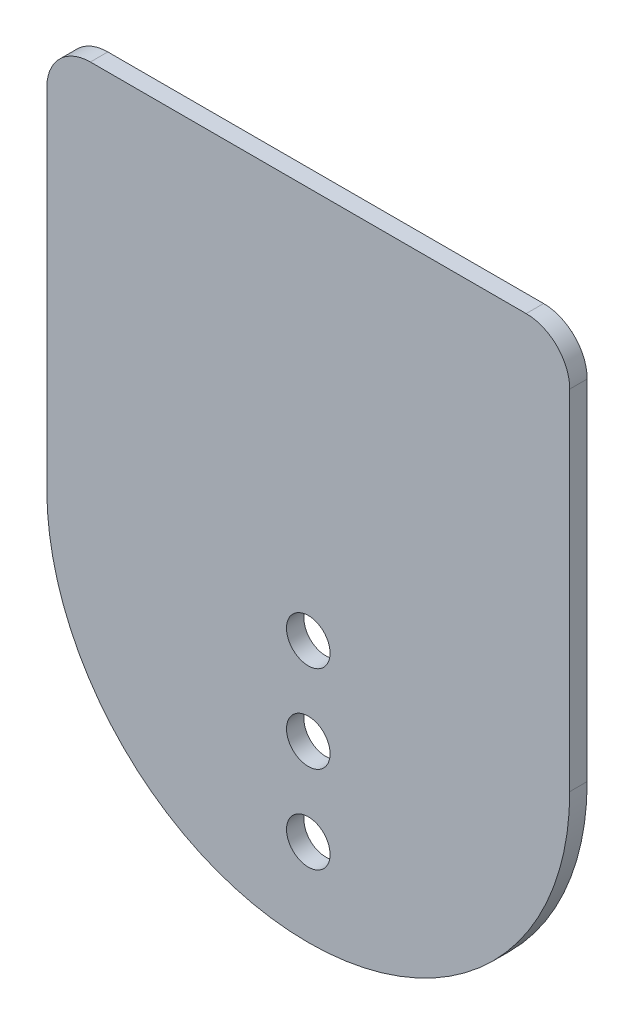
ISO-10303-21;
HEADER;
FILE_DESCRIPTION(('STEP AP214'),'2;1');
FILE_NAME('part.step','',(''),(''),'','','');
FILE_SCHEMA(('AUTOMOTIVE_DESIGN { 1 0 10303 214 1 1 1 1 }'));
ENDSEC;
DATA;
#1=APPLICATION_CONTEXT('core data for automotive mechanical design processes');
#2=APPLICATION_PROTOCOL_DEFINITION('international standard','automotive_design',2000,#1);
#3=PRODUCT_CONTEXT('',#1,'mechanical');
#4=PRODUCT('Part','Part','',(#3));
#5=PRODUCT_RELATED_PRODUCT_CATEGORY('part','',(#4));
#6=PRODUCT_DEFINITION_FORMATION('','',#4);
#7=PRODUCT_DEFINITION_CONTEXT('part definition',#1,'design');
#8=PRODUCT_DEFINITION('design','',#6,#7);
#9=PRODUCT_DEFINITION_SHAPE('','',#8);
#10=(LENGTH_UNIT() NAMED_UNIT(*) SI_UNIT(.MILLI.,.METRE.));
#11=(NAMED_UNIT(*) PLANE_ANGLE_UNIT() SI_UNIT($,.RADIAN.));
#12=(NAMED_UNIT(*) SI_UNIT($,.STERADIAN.) SOLID_ANGLE_UNIT());
#13=UNCERTAINTY_MEASURE_WITH_UNIT(LENGTH_MEASURE(1.E-05),#10,'distance_accuracy_value','');
#14=(GEOMETRIC_REPRESENTATION_CONTEXT(3) GLOBAL_UNCERTAINTY_ASSIGNED_CONTEXT((#13)) GLOBAL_UNIT_ASSIGNED_CONTEXT((#10,
#11,#12)) REPRESENTATION_CONTEXT('',''));
#15=CARTESIAN_POINT('',(0.,0.,0.));
#16=DIRECTION('',(0.,0.,1.));
#17=DIRECTION('',(1.,0.,0.));
#18=AXIS2_PLACEMENT_3D('',#15,#16,#17);
#19=CARTESIAN_POINT('',(10.,-10.,2.));
#20=DIRECTION('',(0.,0.,-1.));
#21=DIRECTION('',(-1.,0.,0.));
#22=AXIS2_PLACEMENT_3D('',#19,#20,#21);
#23=PLANE('',#22);
#24=CARTESIAN_POINT('',(10.,-10.,2.));
#25=DIRECTION('',(0.,0.,1.));
#26=DIRECTION('',(-1.,0.,0.));
#27=AXIS2_PLACEMENT_3D('',#24,#25,#26);
#28=CIRCLE('',#27,10.);
#29=CARTESIAN_POINT('',(10.0000000000001,0.,2.));
#30=VERTEX_POINT('',#29);
#31=CARTESIAN_POINT('',(0.,-10.0000000000001,2.));
#32=VERTEX_POINT('',#31);
#33=EDGE_CURVE('E153',#30,#32,#28,.T.);
#34=ORIENTED_EDGE('',*,*,#33,.T.);
#35=DIRECTION('',(0.,-1.,0.));
#36=VECTOR('',#35,1.);
#37=CARTESIAN_POINT('',(0.,-10.0000000000001,2.));
#38=LINE('',#37,#36);
#39=CARTESIAN_POINT('',(0.,-90.,2.));
#40=VERTEX_POINT('',#39);
#41=EDGE_CURVE('E100',#32,#40,#38,.T.);
#42=ORIENTED_EDGE('',*,*,#41,.T.);
#43=CARTESIAN_POINT('',(60.,-90.,2.));
#44=DIRECTION('',(0.,0.,1.));
#45=DIRECTION('',(-1.,0.,0.));
#46=AXIS2_PLACEMENT_3D('',#43,#44,#45);
#47=CIRCLE('',#46,60.);
#48=CARTESIAN_POINT('',(120.,-90.,2.));
#49=VERTEX_POINT('',#48);
#50=EDGE_CURVE('E113',#40,#49,#47,.T.);
#51=ORIENTED_EDGE('',*,*,#50,.T.);
#52=DIRECTION('',(0.,1.,0.));
#53=VECTOR('',#52,1.);
#54=CARTESIAN_POINT('',(120.,-10.,2.));
#55=LINE('',#54,#53);
#56=CARTESIAN_POINT('',(120.,-10.,2.));
#57=VERTEX_POINT('',#56);
#58=EDGE_CURVE('E107',#49,#57,#55,.T.);
#59=ORIENTED_EDGE('',*,*,#58,.T.);
#60=CARTESIAN_POINT('',(110.,-10.,2.));
#61=DIRECTION('',(0.,0.,1.));
#62=DIRECTION('',(1.,0.,0.));
#63=AXIS2_PLACEMENT_3D('',#60,#61,#62);
#64=CIRCLE('',#63,10.);
#65=CARTESIAN_POINT('',(110.,0.,2.));
#66=VERTEX_POINT('',#65);
#67=EDGE_CURVE('E111',#57,#66,#64,.T.);
#68=ORIENTED_EDGE('',*,*,#67,.T.);
#69=DIRECTION('',(-1.,0.,0.));
#70=VECTOR('',#69,1.);
#71=CARTESIAN_POINT('',(10.0000000000001,0.,2.));
#72=LINE('',#71,#70);
#73=EDGE_CURVE('E63',#66,#30,#72,.T.);
#74=ORIENTED_EDGE('',*,*,#73,.T.);
#75=EDGE_LOOP('',(#34,#42,#51,#59,#68,#74));
#76=FACE_BOUND('',#75,.T.);
#77=CARTESIAN_POINT('',(60.0000000000001,-130.,2.));
#78=DIRECTION('',(0.,0.,1.));
#79=DIRECTION('',(1.,0.,0.));
#80=AXIS2_PLACEMENT_3D('',#77,#78,#79);
#81=CIRCLE('',#80,5.);
#82=CARTESIAN_POINT('',(65.0000000000001,-130.,2.));
#83=VERTEX_POINT('',#82);
#84=EDGE_CURVE('E140',#83,#83,#81,.T.);
#85=ORIENTED_EDGE('',*,*,#84,.F.);
#86=EDGE_LOOP('',(#85));
#87=FACE_BOUND('',#86,.T.);
#88=CARTESIAN_POINT('',(60.0000000000001,-110.,2.));
#89=DIRECTION('',(0.,0.,1.));
#90=DIRECTION('',(1.,0.,0.));
#91=AXIS2_PLACEMENT_3D('',#88,#89,#90);
#92=CIRCLE('',#91,5.);
#93=CARTESIAN_POINT('',(65.0000000000001,-110.,2.));
#94=VERTEX_POINT('',#93);
#95=EDGE_CURVE('E213',#94,#94,#92,.T.);
#96=ORIENTED_EDGE('',*,*,#95,.F.);
#97=EDGE_LOOP('',(#96));
#98=FACE_BOUND('',#97,.T.);
#99=CARTESIAN_POINT('',(60.,-90.,2.));
#100=DIRECTION('',(0.,0.,1.));
#101=DIRECTION('',(1.,0.,0.));
#102=AXIS2_PLACEMENT_3D('',#99,#100,#101);
#103=CIRCLE('',#102,5.);
#104=CARTESIAN_POINT('',(65.,-90.,2.));
#105=VERTEX_POINT('',#104);
#106=EDGE_CURVE('E202',#105,#105,#103,.T.);
#107=ORIENTED_EDGE('',*,*,#106,.F.);
#108=EDGE_LOOP('',(#107));
#109=FACE_BOUND('',#108,.T.);
#110=ADVANCED_FACE('F45',(#76,#87,#98,#109),#23,.F.);
#111=CARTESIAN_POINT('',(10.,-10.,-2.));
#112=DIRECTION('',(0.,0.,-1.));
#113=DIRECTION('',(-1.,0.,0.));
#114=AXIS2_PLACEMENT_3D('',#111,#112,#113);
#115=PLANE('',#114);
#116=CARTESIAN_POINT('',(60.0000000000001,-110.,-2.));
#117=DIRECTION('',(0.,0.,1.));
#118=DIRECTION('',(1.,0.,0.));
#119=AXIS2_PLACEMENT_3D('',#116,#117,#118);
#120=CIRCLE('',#119,5.);
#121=CARTESIAN_POINT('',(65.0000000000001,-110.,-2.));
#122=VERTEX_POINT('',#121);
#123=EDGE_CURVE('E210',#122,#122,#120,.T.);
#124=ORIENTED_EDGE('',*,*,#123,.T.);
#125=EDGE_LOOP('',(#124));
#126=FACE_BOUND('',#125,.T.);
#127=CARTESIAN_POINT('',(10.,-10.,-2.));
#128=DIRECTION('',(0.,0.,1.));
#129=DIRECTION('',(-1.,0.,0.));
#130=AXIS2_PLACEMENT_3D('',#127,#128,#129);
#131=CIRCLE('',#130,10.);
#132=CARTESIAN_POINT('',(10.0000000000001,0.,-2.));
#133=VERTEX_POINT('',#132);
#134=CARTESIAN_POINT('',(0.,-10.0000000000001,-2.));
#135=VERTEX_POINT('',#134);
#136=EDGE_CURVE('E135',#133,#135,#131,.T.);
#137=ORIENTED_EDGE('',*,*,#136,.F.);
#138=DIRECTION('',(-1.,0.,0.));
#139=VECTOR('',#138,1.);
#140=CARTESIAN_POINT('',(10.0000000000001,0.,-2.));
#141=LINE('',#140,#139);
#142=CARTESIAN_POINT('',(110.,0.,-2.));
#143=VERTEX_POINT('',#142);
#144=EDGE_CURVE('E92',#143,#133,#141,.T.);
#145=ORIENTED_EDGE('',*,*,#144,.F.);
#146=CARTESIAN_POINT('',(110.,-10.,-2.));
#147=DIRECTION('',(0.,0.,1.));
#148=DIRECTION('',(1.,0.,0.));
#149=AXIS2_PLACEMENT_3D('',#146,#147,#148);
#150=CIRCLE('',#149,10.);
#151=CARTESIAN_POINT('',(120.,-10.,-2.));
#152=VERTEX_POINT('',#151);
#153=EDGE_CURVE('E86',#152,#143,#150,.T.);
#154=ORIENTED_EDGE('',*,*,#153,.F.);
#155=DIRECTION('',(0.,1.,0.));
#156=VECTOR('',#155,1.);
#157=CARTESIAN_POINT('',(120.,-10.,-2.));
#158=LINE('',#157,#156);
#159=CARTESIAN_POINT('',(120.,-90.,-2.));
#160=VERTEX_POINT('',#159);
#161=EDGE_CURVE('E122',#160,#152,#158,.T.);
#162=ORIENTED_EDGE('',*,*,#161,.F.);
#163=CARTESIAN_POINT('',(60.,-90.,-2.));
#164=DIRECTION('',(0.,0.,1.));
#165=DIRECTION('',(1.,0.,0.));
#166=AXIS2_PLACEMENT_3D('',#163,#164,#165);
#167=CIRCLE('',#166,60.);
#168=CARTESIAN_POINT('',(0.,-90.,-2.));
#169=VERTEX_POINT('',#168);
#170=EDGE_CURVE('E144',#169,#160,#167,.T.);
#171=ORIENTED_EDGE('',*,*,#170,.F.);
#172=DIRECTION('',(0.,-1.,0.));
#173=VECTOR('',#172,1.);
#174=CARTESIAN_POINT('',(0.,-10.0000000000001,-2.));
#175=LINE('',#174,#173);
#176=EDGE_CURVE('E139',#135,#169,#175,.T.);
#177=ORIENTED_EDGE('',*,*,#176,.F.);
#178=EDGE_LOOP('',(#137,#145,#154,#162,#171,#177));
#179=FACE_BOUND('',#178,.T.);
#180=CARTESIAN_POINT('',(60.0000000000001,-130.,-2.));
#181=DIRECTION('',(0.,0.,1.));
#182=DIRECTION('',(1.,0.,0.));
#183=AXIS2_PLACEMENT_3D('',#180,#181,#182);
#184=CIRCLE('',#183,5.);
#185=CARTESIAN_POINT('',(65.0000000000001,-130.,-2.));
#186=VERTEX_POINT('',#185);
#187=EDGE_CURVE('E217',#186,#186,#184,.T.);
#188=ORIENTED_EDGE('',*,*,#187,.T.);
#189=EDGE_LOOP('',(#188));
#190=FACE_BOUND('',#189,.T.);
#191=CARTESIAN_POINT('',(60.,-90.,-2.));
#192=DIRECTION('',(0.,0.,1.));
#193=DIRECTION('',(1.,0.,0.));
#194=AXIS2_PLACEMENT_3D('',#191,#192,#193);
#195=CIRCLE('',#194,5.);
#196=CARTESIAN_POINT('',(65.,-90.,-2.));
#197=VERTEX_POINT('',#196);
#198=EDGE_CURVE('E205',#197,#197,#195,.T.);
#199=ORIENTED_EDGE('',*,*,#198,.T.);
#200=EDGE_LOOP('',(#199));
#201=FACE_BOUND('',#200,.T.);
#202=ADVANCED_FACE('F167',(#126,#179,#190,#201),#115,.T.);
#203=CARTESIAN_POINT('',(10.,-10.,2.));
#204=DIRECTION('',(0.,0.,-1.));
#205=DIRECTION('',(-1.,0.,0.));
#206=AXIS2_PLACEMENT_3D('',#203,#204,#205);
#207=CYLINDRICAL_SURFACE('',#206,10.);
#208=ORIENTED_EDGE('',*,*,#136,.T.);
#209=DIRECTION('',(0.,0.,-1.));
#210=VECTOR('',#209,1.);
#211=CARTESIAN_POINT('',(0.,-10.0000000000001,2.));
#212=LINE('',#211,#210);
#213=EDGE_CURVE('E11',#32,#135,#212,.T.);
#214=ORIENTED_EDGE('',*,*,#213,.F.);
#215=ORIENTED_EDGE('',*,*,#33,.F.);
#216=DIRECTION('',(0.,0.,-1.));
#217=VECTOR('',#216,1.);
#218=CARTESIAN_POINT('',(10.0000000000001,0.,2.));
#219=LINE('',#218,#217);
#220=EDGE_CURVE('E131',#30,#133,#219,.T.);
#221=ORIENTED_EDGE('',*,*,#220,.T.);
#222=EDGE_LOOP('',(#208,#214,#215,#221));
#223=FACE_BOUND('',#222,.T.);
#224=ADVANCED_FACE('F47',(#223),#207,.T.);
#225=CARTESIAN_POINT('',(0.,-10.0000000000001,2.));
#226=DIRECTION('',(1.,0.,0.));
#227=DIRECTION('',(0.,1.,0.));
#228=AXIS2_PLACEMENT_3D('',#225,#226,#227);
#229=PLANE('',#228);
#230=ORIENTED_EDGE('',*,*,#176,.T.);
#231=DIRECTION('',(0.,0.,-1.));
#232=VECTOR('',#231,1.);
#233=CARTESIAN_POINT('',(0.,-90.,2.));
#234=LINE('',#233,#232);
#235=EDGE_CURVE('E55',#40,#169,#234,.T.);
#236=ORIENTED_EDGE('',*,*,#235,.F.);
#237=ORIENTED_EDGE('',*,*,#41,.F.);
#238=ORIENTED_EDGE('',*,*,#213,.T.);
#239=EDGE_LOOP('',(#230,#236,#237,#238));
#240=FACE_BOUND('',#239,.T.);
#241=ADVANCED_FACE('F163',(#240),#229,.F.);
#242=CARTESIAN_POINT('',(60.,-90.,2.));
#243=DIRECTION('',(0.,0.,-1.));
#244=DIRECTION('',(-1.,0.,0.));
#245=AXIS2_PLACEMENT_3D('',#242,#243,#244);
#246=CYLINDRICAL_SURFACE('',#245,60.);
#247=ORIENTED_EDGE('',*,*,#170,.T.);
#248=DIRECTION('',(0.,0.,-1.));
#249=VECTOR('',#248,1.);
#250=CARTESIAN_POINT('',(120.,-90.,2.));
#251=LINE('',#250,#249);
#252=EDGE_CURVE('E124',#49,#160,#251,.T.);
#253=ORIENTED_EDGE('',*,*,#252,.F.);
#254=ORIENTED_EDGE('',*,*,#50,.F.);
#255=ORIENTED_EDGE('',*,*,#235,.T.);
#256=EDGE_LOOP('',(#247,#253,#254,#255));
#257=FACE_BOUND('',#256,.T.);
#258=ADVANCED_FACE('F162',(#257),#246,.T.);
#259=CARTESIAN_POINT('',(120.,-10.,2.));
#260=DIRECTION('',(-1.,0.,0.));
#261=DIRECTION('',(0.,0.,1.));
#262=AXIS2_PLACEMENT_3D('',#259,#260,#261);
#263=PLANE('',#262);
#264=ORIENTED_EDGE('',*,*,#161,.T.);
#265=DIRECTION('',(0.,0.,-1.));
#266=VECTOR('',#265,1.);
#267=CARTESIAN_POINT('',(120.,-10.,2.));
#268=LINE('',#267,#266);
#269=EDGE_CURVE('E119',#57,#152,#268,.T.);
#270=ORIENTED_EDGE('',*,*,#269,.F.);
#271=ORIENTED_EDGE('',*,*,#58,.F.);
#272=ORIENTED_EDGE('',*,*,#252,.T.);
#273=EDGE_LOOP('',(#264,#270,#271,#272));
#274=FACE_BOUND('',#273,.T.);
#275=ADVANCED_FACE('F120',(#274),#263,.F.);
#276=CARTESIAN_POINT('',(110.,-10.,2.));
#277=DIRECTION('',(0.,0.,-1.));
#278=DIRECTION('',(-1.,0.,0.));
#279=AXIS2_PLACEMENT_3D('',#276,#277,#278);
#280=CYLINDRICAL_SURFACE('',#279,10.);
#281=ORIENTED_EDGE('',*,*,#153,.T.);
#282=DIRECTION('',(0.,0.,-1.));
#283=VECTOR('',#282,1.);
#284=CARTESIAN_POINT('',(110.,0.,2.));
#285=LINE('',#284,#283);
#286=EDGE_CURVE('E125',#66,#143,#285,.T.);
#287=ORIENTED_EDGE('',*,*,#286,.F.);
#288=ORIENTED_EDGE('',*,*,#67,.F.);
#289=ORIENTED_EDGE('',*,*,#269,.T.);
#290=EDGE_LOOP('',(#281,#287,#288,#289));
#291=FACE_BOUND('',#290,.T.);
#292=ADVANCED_FACE('F127',(#291),#280,.T.);
#293=CARTESIAN_POINT('',(10.0000000000001,0.,2.));
#294=DIRECTION('',(0.,-1.,0.));
#295=DIRECTION('',(0.,0.,-1.));
#296=AXIS2_PLACEMENT_3D('',#293,#294,#295);
#297=PLANE('',#296);
#298=ORIENTED_EDGE('',*,*,#144,.T.);
#299=ORIENTED_EDGE('',*,*,#220,.F.);
#300=ORIENTED_EDGE('',*,*,#73,.F.);
#301=ORIENTED_EDGE('',*,*,#286,.T.);
#302=EDGE_LOOP('',(#298,#299,#300,#301));
#303=FACE_BOUND('',#302,.T.);
#304=ADVANCED_FACE('F171',(#303),#297,.F.);
#305=CARTESIAN_POINT('',(60.0000000000001,-130.,2.));
#306=DIRECTION('',(0.,0.,-1.));
#307=DIRECTION('',(-1.,0.,0.));
#308=AXIS2_PLACEMENT_3D('',#305,#306,#307);
#309=CYLINDRICAL_SURFACE('',#308,5.);
#310=ORIENTED_EDGE('',*,*,#84,.T.);
#311=EDGE_LOOP('',(#310));
#312=FACE_BOUND('',#311,.T.);
#313=ORIENTED_EDGE('',*,*,#187,.F.);
#314=EDGE_LOOP('',(#313));
#315=FACE_BOUND('',#314,.T.);
#316=ADVANCED_FACE('F173',(#312,#315),#309,.F.);
#317=CARTESIAN_POINT('',(60.0000000000001,-110.,2.));
#318=DIRECTION('',(0.,0.,-1.));
#319=DIRECTION('',(-1.,0.,0.));
#320=AXIS2_PLACEMENT_3D('',#317,#318,#319);
#321=CYLINDRICAL_SURFACE('',#320,5.);
#322=ORIENTED_EDGE('',*,*,#95,.T.);
#323=EDGE_LOOP('',(#322));
#324=FACE_BOUND('',#323,.T.);
#325=ORIENTED_EDGE('',*,*,#123,.F.);
#326=EDGE_LOOP('',(#325));
#327=FACE_BOUND('',#326,.T.);
#328=ADVANCED_FACE('F179',(#324,#327),#321,.F.);
#329=CARTESIAN_POINT('',(60.,-90.,2.));
#330=DIRECTION('',(0.,0.,-1.));
#331=DIRECTION('',(-1.,0.,0.));
#332=AXIS2_PLACEMENT_3D('',#329,#330,#331);
#333=CYLINDRICAL_SURFACE('',#332,5.);
#334=ORIENTED_EDGE('',*,*,#106,.T.);
#335=EDGE_LOOP('',(#334));
#336=FACE_BOUND('',#335,.T.);
#337=ORIENTED_EDGE('',*,*,#198,.F.);
#338=EDGE_LOOP('',(#337));
#339=FACE_BOUND('',#338,.T.);
#340=ADVANCED_FACE('F193',(#336,#339),#333,.F.);
#341=CLOSED_SHELL('',(#110,#202,#224,#241,#258,#275,#292,#304,#316,#328,#340));
#342=MANIFOLD_SOLID_BREP('B2',#341);
#343=ADVANCED_BREP_SHAPE_REPRESENTATION('',(#18,#342),#14);
#344=SHAPE_DEFINITION_REPRESENTATION(#9,#343);
ENDSEC;
END-ISO-10303-21;
